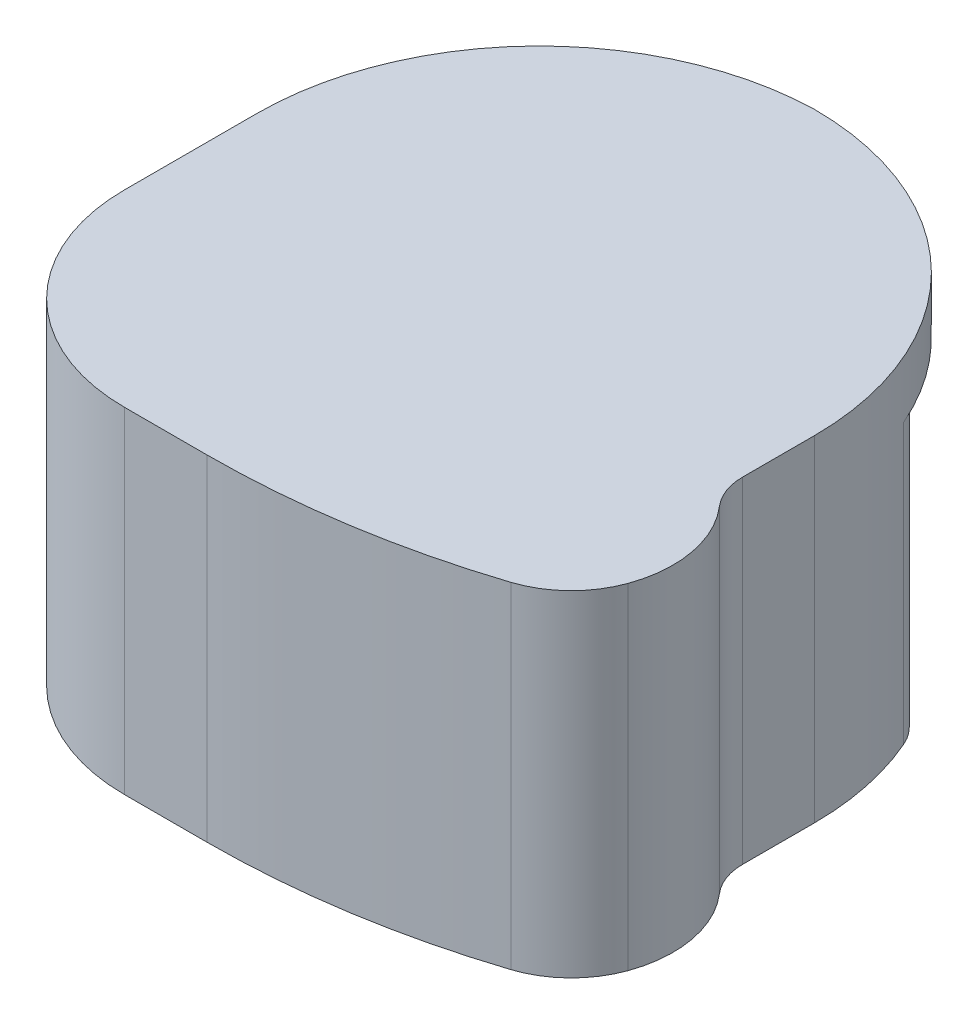
ISO-10303-21;
HEADER;
FILE_DESCRIPTION(('STEP AP214'),'2;1');
FILE_NAME('part.step','',(''),(''),'','','');
FILE_SCHEMA(('AUTOMOTIVE_DESIGN { 1 0 10303 214 1 1 1 1 }'));
ENDSEC;
DATA;
#1=APPLICATION_CONTEXT('core data for automotive mechanical design processes');
#2=APPLICATION_PROTOCOL_DEFINITION('international standard','automotive_design',2000,#1);
#3=PRODUCT_CONTEXT('',#1,'mechanical');
#4=PRODUCT('Part','Part','',(#3));
#5=PRODUCT_RELATED_PRODUCT_CATEGORY('part','',(#4));
#6=PRODUCT_DEFINITION_FORMATION('','',#4);
#7=PRODUCT_DEFINITION_CONTEXT('part definition',#1,'design');
#8=PRODUCT_DEFINITION('design','',#6,#7);
#9=PRODUCT_DEFINITION_SHAPE('','',#8);
#10=(LENGTH_UNIT() NAMED_UNIT(*) SI_UNIT(.MILLI.,.METRE.));
#11=(NAMED_UNIT(*) PLANE_ANGLE_UNIT() SI_UNIT($,.RADIAN.));
#12=(NAMED_UNIT(*) SI_UNIT($,.STERADIAN.) SOLID_ANGLE_UNIT());
#13=UNCERTAINTY_MEASURE_WITH_UNIT(LENGTH_MEASURE(1.E-05),#10,'distance_accuracy_value','');
#14=(GEOMETRIC_REPRESENTATION_CONTEXT(3) GLOBAL_UNCERTAINTY_ASSIGNED_CONTEXT((#13)) GLOBAL_UNIT_ASSIGNED_CONTEXT((#10,
#11,#12)) REPRESENTATION_CONTEXT('',''));
#15=CARTESIAN_POINT('',(0.,0.,0.));
#16=DIRECTION('',(0.,0.,1.));
#17=DIRECTION('',(1.,0.,0.));
#18=AXIS2_PLACEMENT_3D('',#15,#16,#17);
#19=CARTESIAN_POINT('',(26.1999999999403,3.,113.8));
#20=DIRECTION('',(0.,-1.,0.));
#21=DIRECTION('',(0.,0.,-1.));
#22=AXIS2_PLACEMENT_3D('',#19,#20,#21);
#23=CYLINDRICAL_SURFACE('',#22,1.5);
#24=CARTESIAN_POINT('',(26.1999999999403,-14.8,113.8));
#25=DIRECTION('',(0.,1.,0.));
#26=DIRECTION('',(0.,0.,-1.));
#27=AXIS2_PLACEMENT_3D('',#24,#25,#26);
#28=CIRCLE('',#27,1.5);
#29=CARTESIAN_POINT('',(26.1999999999403,-14.8,112.3));
#30=VERTEX_POINT('',#29);
#31=EDGE_CURVE('E213',#30,#30,#28,.T.);
#32=ORIENTED_EDGE('',*,*,#31,.F.);
#33=EDGE_LOOP('',(#32));
#34=FACE_BOUND('',#33,.T.);
#35=CARTESIAN_POINT('',(26.1999999999403,2.8,113.8));
#36=DIRECTION('',(0.,1.,0.));
#37=DIRECTION('',(0.,0.,1.));
#38=AXIS2_PLACEMENT_3D('',#35,#36,#37);
#39=CIRCLE('',#38,1.5);
#40=CARTESIAN_POINT('',(26.1999999999403,2.8,115.3));
#41=VERTEX_POINT('',#40);
#42=EDGE_CURVE('E1001',#41,#41,#39,.T.);
#43=ORIENTED_EDGE('',*,*,#42,.T.);
#44=EDGE_LOOP('',(#43));
#45=FACE_BOUND('',#44,.T.);
#46=ADVANCED_FACE('F35',(#34,#45),#23,.F.);
#47=CARTESIAN_POINT('',(22.2999999999403,3.,97.8000000000001));
#48=DIRECTION('',(0.,-1.,0.));
#49=DIRECTION('',(0.,0.,-1.));
#50=AXIS2_PLACEMENT_3D('',#47,#48,#49);
#51=CYLINDRICAL_SURFACE('',#50,1.5);
#52=CARTESIAN_POINT('',(22.2999999999403,-14.8,97.8000000000001));
#53=DIRECTION('',(0.,1.,0.));
#54=DIRECTION('',(0.,0.,-1.));
#55=AXIS2_PLACEMENT_3D('',#52,#53,#54);
#56=CIRCLE('',#55,1.5);
#57=CARTESIAN_POINT('',(22.2999999999403,-14.8,96.3000000000001));
#58=VERTEX_POINT('',#57);
#59=EDGE_CURVE('E210',#58,#58,#56,.T.);
#60=ORIENTED_EDGE('',*,*,#59,.F.);
#61=EDGE_LOOP('',(#60));
#62=FACE_BOUND('',#61,.T.);
#63=CARTESIAN_POINT('',(22.2999999999403,2.8,97.8000000000001));
#64=DIRECTION('',(0.,1.,0.));
#65=DIRECTION('',(0.,0.,1.));
#66=AXIS2_PLACEMENT_3D('',#63,#64,#65);
#67=CIRCLE('',#66,1.5);
#68=CARTESIAN_POINT('',(22.2999999999403,2.8,99.3000000000001));
#69=VERTEX_POINT('',#68);
#70=EDGE_CURVE('E996',#69,#69,#67,.T.);
#71=ORIENTED_EDGE('',*,*,#70,.T.);
#72=EDGE_LOOP('',(#71));
#73=FACE_BOUND('',#72,.T.);
#74=ADVANCED_FACE('F493',(#62,#73),#51,.F.);
#75=CARTESIAN_POINT('',(37.5999999998806,3.,113.8));
#76=DIRECTION('',(0.,-1.,0.));
#77=DIRECTION('',(0.,0.,-1.));
#78=AXIS2_PLACEMENT_3D('',#75,#76,#77);
#79=CYLINDRICAL_SURFACE('',#78,1.5);
#80=CARTESIAN_POINT('',(37.5999999998806,-14.8,113.8));
#81=DIRECTION('',(0.,1.,0.));
#82=DIRECTION('',(0.,0.,-1.));
#83=AXIS2_PLACEMENT_3D('',#80,#81,#82);
#84=CIRCLE('',#83,1.5);
#85=CARTESIAN_POINT('',(37.5999999998806,-14.8,112.3));
#86=VERTEX_POINT('',#85);
#87=EDGE_CURVE('E977',#86,#86,#84,.T.);
#88=ORIENTED_EDGE('',*,*,#87,.F.);
#89=EDGE_LOOP('',(#88));
#90=FACE_BOUND('',#89,.T.);
#91=CARTESIAN_POINT('',(37.5999999998806,2.8,113.8));
#92=DIRECTION('',(0.,1.,0.));
#93=DIRECTION('',(0.,0.,1.));
#94=AXIS2_PLACEMENT_3D('',#91,#92,#93);
#95=CIRCLE('',#94,1.5);
#96=CARTESIAN_POINT('',(37.5999999998806,2.8,115.3));
#97=VERTEX_POINT('',#96);
#98=EDGE_CURVE('E994',#97,#97,#95,.T.);
#99=ORIENTED_EDGE('',*,*,#98,.T.);
#100=EDGE_LOOP('',(#99));
#101=FACE_BOUND('',#100,.T.);
#102=ADVANCED_FACE('F473',(#90,#101),#79,.F.);
#103=CARTESIAN_POINT('',(44.5999999998807,3.,110.));
#104=DIRECTION('',(0.,-1.,0.));
#105=DIRECTION('',(0.,0.,-1.));
#106=AXIS2_PLACEMENT_3D('',#103,#104,#105);
#107=CYLINDRICAL_SURFACE('',#106,1.8);
#108=CARTESIAN_POINT('',(44.5999999998807,-9.5,110.));
#109=DIRECTION('',(0.,1.,0.));
#110=DIRECTION('',(0.,0.,-1.));
#111=AXIS2_PLACEMENT_3D('',#108,#109,#110);
#112=CIRCLE('',#111,1.8);
#113=CARTESIAN_POINT('',(44.5999999998807,-9.5,108.2));
#114=VERTEX_POINT('',#113);
#115=EDGE_CURVE('E263',#114,#114,#112,.F.);
#116=ORIENTED_EDGE('',*,*,#115,.T.);
#117=EDGE_LOOP('',(#116));
#118=FACE_BOUND('',#117,.T.);
#119=CARTESIAN_POINT('',(44.5999999998807,2.8,110.));
#120=DIRECTION('',(0.,1.,0.));
#121=DIRECTION('',(0.,0.,1.));
#122=AXIS2_PLACEMENT_3D('',#119,#120,#121);
#123=CIRCLE('',#122,1.8);
#124=CARTESIAN_POINT('',(44.5999999998807,2.8,111.8));
#125=VERTEX_POINT('',#124);
#126=EDGE_CURVE('E377',#125,#125,#123,.F.);
#127=ORIENTED_EDGE('',*,*,#126,.F.);
#128=EDGE_LOOP('',(#127));
#129=FACE_BOUND('',#128,.T.);
#130=ADVANCED_FACE('F469',(#118,#129),#107,.F.);
#131=CARTESIAN_POINT('',(44.8999999999403,3.,101.3));
#132=DIRECTION('',(0.,-1.,0.));
#133=DIRECTION('',(0.,0.,-1.));
#134=AXIS2_PLACEMENT_3D('',#131,#132,#133);
#135=CYLINDRICAL_SURFACE('',#134,1.5);
#136=CARTESIAN_POINT('',(44.8999999999403,-14.8,101.3));
#137=DIRECTION('',(0.,1.,0.));
#138=DIRECTION('',(0.,0.,-1.));
#139=AXIS2_PLACEMENT_3D('',#136,#137,#138);
#140=CIRCLE('',#139,1.5);
#141=CARTESIAN_POINT('',(44.8999999999403,-14.8,99.8));
#142=VERTEX_POINT('',#141);
#143=EDGE_CURVE('E981',#142,#142,#140,.T.);
#144=ORIENTED_EDGE('',*,*,#143,.F.);
#145=EDGE_LOOP('',(#144));
#146=FACE_BOUND('',#145,.T.);
#147=CARTESIAN_POINT('',(44.8999999999403,2.8,101.3));
#148=DIRECTION('',(0.,1.,0.));
#149=DIRECTION('',(0.,0.,1.));
#150=AXIS2_PLACEMENT_3D('',#147,#148,#149);
#151=CIRCLE('',#150,1.5);
#152=CARTESIAN_POINT('',(44.8999999999403,2.8,102.8));
#153=VERTEX_POINT('',#152);
#154=EDGE_CURVE('E995',#153,#153,#151,.T.);
#155=ORIENTED_EDGE('',*,*,#154,.T.);
#156=EDGE_LOOP('',(#155));
#157=FACE_BOUND('',#156,.T.);
#158=ADVANCED_FACE('F472',(#146,#157),#135,.F.);
#159=CARTESIAN_POINT('',(33.5999999999403,3.,105.3));
#160=DIRECTION('',(0.,-1.,0.));
#161=DIRECTION('',(0.,0.,-1.));
#162=AXIS2_PLACEMENT_3D('',#159,#160,#161);
#163=CYLINDRICAL_SURFACE('',#162,1.8);
#164=CARTESIAN_POINT('',(33.5999999999403,0.,105.3));
#165=DIRECTION('',(0.,-1.,0.));
#166=DIRECTION('',(0.,0.,1.));
#167=AXIS2_PLACEMENT_3D('',#164,#165,#166);
#168=CIRCLE('',#167,1.8);
#169=CARTESIAN_POINT('',(33.5999999999403,0.,107.1));
#170=VERTEX_POINT('',#169);
#171=EDGE_CURVE('E275',#170,#170,#168,.T.);
#172=ORIENTED_EDGE('',*,*,#171,.T.);
#173=EDGE_LOOP('',(#172));
#174=FACE_BOUND('',#173,.T.);
#175=CARTESIAN_POINT('',(33.5999999999403,1.2,105.3));
#176=DIRECTION('',(0.,1.,0.));
#177=DIRECTION('',(0.,0.,1.));
#178=AXIS2_PLACEMENT_3D('',#175,#176,#177);
#179=CIRCLE('',#178,1.79999999999999);
#180=CARTESIAN_POINT('',(33.5999999999403,1.2,107.1));
#181=VERTEX_POINT('',#180);
#182=EDGE_CURVE('E984',#181,#181,#179,.T.);
#183=ORIENTED_EDGE('',*,*,#182,.T.);
#184=EDGE_LOOP('',(#183));
#185=FACE_BOUND('',#184,.T.);
#186=ADVANCED_FACE('F506',(#174,#185),#163,.F.);
#187=CARTESIAN_POINT('',(33.5999999999403,3.,90.3));
#188=DIRECTION('',(0.,-1.,0.));
#189=DIRECTION('',(0.,0.,-1.));
#190=AXIS2_PLACEMENT_3D('',#187,#188,#189);
#191=CYLINDRICAL_SURFACE('',#190,1.8);
#192=CARTESIAN_POINT('',(33.5999999999403,0.,90.3));
#193=DIRECTION('',(0.,-1.,0.));
#194=DIRECTION('',(0.,0.,1.));
#195=AXIS2_PLACEMENT_3D('',#192,#193,#194);
#196=CIRCLE('',#195,1.8);
#197=CARTESIAN_POINT('',(33.5999999999403,0.,92.1));
#198=VERTEX_POINT('',#197);
#199=EDGE_CURVE('E279',#198,#198,#196,.F.);
#200=ORIENTED_EDGE('',*,*,#199,.F.);
#201=EDGE_LOOP('',(#200));
#202=FACE_BOUND('',#201,.T.);
#203=CARTESIAN_POINT('',(33.5999999999403,1.2,90.3));
#204=DIRECTION('',(0.,1.,0.));
#205=DIRECTION('',(0.,0.,1.));
#206=AXIS2_PLACEMENT_3D('',#203,#204,#205);
#207=CIRCLE('',#206,1.8);
#208=CARTESIAN_POINT('',(33.5999999999403,1.2,92.1));
#209=VERTEX_POINT('',#208);
#210=EDGE_CURVE('E374',#209,#209,#207,.F.);
#211=ORIENTED_EDGE('',*,*,#210,.F.);
#212=EDGE_LOOP('',(#211));
#213=FACE_BOUND('',#212,.T.);
#214=ADVANCED_FACE('F509',(#202,#213),#191,.F.);
#215=CARTESIAN_POINT('',(41.1999999999403,-10.5,110.1));
#216=DIRECTION('',(0.,1.,0.));
#217=DIRECTION('',(0.,0.,1.));
#218=AXIS2_PLACEMENT_3D('',#215,#216,#217);
#219=CYLINDRICAL_SURFACE('',#218,0.2);
#220=CARTESIAN_POINT('',(41.1999999999403,-9.5,110.1));
#221=DIRECTION('',(0.,1.,0.));
#222=DIRECTION('',(0.,0.,-1.));
#223=AXIS2_PLACEMENT_3D('',#220,#221,#222);
#224=CIRCLE('',#223,0.2);
#225=CARTESIAN_POINT('',(41.3999999999403,-9.5,110.1));
#226=VERTEX_POINT('',#225);
#227=CARTESIAN_POINT('',(41.1999999999403,-9.5,110.3));
#228=VERTEX_POINT('',#227);
#229=EDGE_CURVE('E337',#226,#228,#224,.F.);
#230=ORIENTED_EDGE('',*,*,#229,.T.);
#231=DIRECTION('',(0.,1.,0.));
#232=VECTOR('',#231,1.);
#233=CARTESIAN_POINT('',(41.1999999999403,-10.5,110.3));
#234=LINE('',#233,#232);
#235=CARTESIAN_POINT('',(41.1999999999403,0.,110.3));
#236=VERTEX_POINT('',#235);
#237=EDGE_CURVE('E328',#228,#236,#234,.T.);
#238=ORIENTED_EDGE('',*,*,#237,.T.);
#239=CARTESIAN_POINT('',(41.1999999999403,0.,110.1));
#240=DIRECTION('',(0.,-1.,0.));
#241=DIRECTION('',(0.,0.,1.));
#242=AXIS2_PLACEMENT_3D('',#239,#240,#241);
#243=CIRCLE('',#242,0.2);
#244=CARTESIAN_POINT('',(41.3999999999403,0.,110.1));
#245=VERTEX_POINT('',#244);
#246=EDGE_CURVE('E322',#236,#245,#243,.F.);
#247=ORIENTED_EDGE('',*,*,#246,.T.);
#248=DIRECTION('',(0.,1.,0.));
#249=VECTOR('',#248,1.);
#250=CARTESIAN_POINT('',(41.3999999999403,-10.5,110.1));
#251=LINE('',#250,#249);
#252=EDGE_CURVE('E334',#245,#226,#251,.F.);
#253=ORIENTED_EDGE('',*,*,#252,.T.);
#254=EDGE_LOOP('',(#230,#238,#247,#253));
#255=FACE_BOUND('',#254,.T.);
#256=ADVANCED_FACE('F461',(#255),#219,.F.);
#257=CARTESIAN_POINT('',(48.3999999999403,3.,0.));
#258=DIRECTION('',(1.,0.,0.));
#259=DIRECTION('',(0.,0.,1.));
#260=AXIS2_PLACEMENT_3D('',#257,#258,#259);
#261=PLANE('',#260);
#262=DIRECTION('',(0.,0.,-1.));
#263=VECTOR('',#262,1.);
#264=CARTESIAN_POINT('',(48.3999999999403,3.,0.));
#265=LINE('',#264,#263);
#266=CARTESIAN_POINT('',(48.3999999999403,3.,104.104238810875));
#267=VERTEX_POINT('',#266);
#268=CARTESIAN_POINT('',(48.3999999999403,3.,100.3));
#269=VERTEX_POINT('',#268);
#270=EDGE_CURVE('E276',#267,#269,#265,.T.);
#271=ORIENTED_EDGE('',*,*,#270,.F.);
#272=DIRECTION('',(0.,-1.,0.));
#273=VECTOR('',#272,1.);
#274=CARTESIAN_POINT('',(48.3999999999403,3.,104.104238810875));
#275=LINE('',#274,#273);
#276=CARTESIAN_POINT('',(48.3999999999403,-14.8,104.104238810875));
#277=VERTEX_POINT('',#276);
#278=EDGE_CURVE('E386',#267,#277,#275,.T.);
#279=ORIENTED_EDGE('',*,*,#278,.T.);
#280=DIRECTION('',(0.,0.,-1.));
#281=VECTOR('',#280,1.);
#282=CARTESIAN_POINT('',(48.3999999999403,-14.8,105.356725293551));
#283=LINE('',#282,#281);
#284=CARTESIAN_POINT('',(48.3999999999403,-14.8,100.3));
#285=VERTEX_POINT('',#284);
#286=EDGE_CURVE('E252',#277,#285,#283,.T.);
#287=ORIENTED_EDGE('',*,*,#286,.T.);
#288=DIRECTION('',(0.,-1.,0.));
#289=VECTOR('',#288,1.);
#290=CARTESIAN_POINT('',(48.3999999999403,3.,100.3));
#291=LINE('',#290,#289);
#292=EDGE_CURVE('E209',#269,#285,#291,.T.);
#293=ORIENTED_EDGE('',*,*,#292,.F.);
#294=EDGE_LOOP('',(#271,#279,#287,#293));
#295=FACE_BOUND('',#294,.T.);
#296=ADVANCED_FACE('F392',(#295),#261,.T.);
#297=CARTESIAN_POINT('',(44.5999999998807,3.,110.));
#298=DIRECTION('',(0.,-1.,0.));
#299=DIRECTION('',(0.,0.,-1.));
#300=AXIS2_PLACEMENT_3D('',#297,#298,#299);
#301=CYLINDRICAL_SURFACE('',#300,6.);
#302=CARTESIAN_POINT('',(44.5999999998807,-14.8,110.));
#303=DIRECTION('',(0.,1.,0.));
#304=DIRECTION('',(0.,0.,-1.));
#305=AXIS2_PLACEMENT_3D('',#302,#303,#304);
#306=CIRCLE('',#305,6.);
#307=CARTESIAN_POINT('',(50.2472360342484,-14.8,112.026999055781));
#308=VERTEX_POINT('',#307);
#309=CARTESIAN_POINT('',(49.1333333332538,-14.8,106.069492540583));
#310=VERTEX_POINT('',#309);
#311=EDGE_CURVE('E250',#308,#310,#306,.T.);
#312=ORIENTED_EDGE('',*,*,#311,.T.);
#313=DIRECTION('',(0.,-1.,0.));
#314=VECTOR('',#313,1.);
#315=CARTESIAN_POINT('',(49.1333333332538,3.,106.069492540583));
#316=LINE('',#315,#314);
#317=CARTESIAN_POINT('',(49.1333333332538,3.,106.069492540583));
#318=VERTEX_POINT('',#317);
#319=EDGE_CURVE('E57',#310,#318,#316,.F.);
#320=ORIENTED_EDGE('',*,*,#319,.T.);
#321=CARTESIAN_POINT('',(44.5999999998807,3.,110.));
#322=DIRECTION('',(0.,-1.,0.));
#323=DIRECTION('',(0.,0.,1.));
#324=AXIS2_PLACEMENT_3D('',#321,#322,#323);
#325=CIRCLE('',#324,6.);
#326=CARTESIAN_POINT('',(50.2472360342484,3.,112.026999055781));
#327=VERTEX_POINT('',#326);
#328=EDGE_CURVE('E278',#318,#327,#325,.T.);
#329=ORIENTED_EDGE('',*,*,#328,.T.);
#330=DIRECTION('',(0.,-1.,0.));
#331=VECTOR('',#330,1.);
#332=CARTESIAN_POINT('',(50.2472360342484,3.,112.026999055781));
#333=LINE('',#332,#331);
#334=EDGE_CURVE('E307',#308,#327,#333,.F.);
#335=ORIENTED_EDGE('',*,*,#334,.F.);
#336=EDGE_LOOP('',(#312,#320,#329,#335));
#337=FACE_BOUND('',#336,.T.);
#338=ADVANCED_FACE('F401',(#337),#301,.T.);
#339=CARTESIAN_POINT('',(37.5999999998806,3.,117.3));
#340=DIRECTION('',(0.,0.,-1.));
#341=DIRECTION('',(1.,0.,0.));
#342=AXIS2_PLACEMENT_3D('',#339,#340,#341);
#343=PLANE('',#342);
#344=DIRECTION('',(-1.,0.,0.));
#345=VECTOR('',#344,1.);
#346=CARTESIAN_POINT('',(37.5999999998806,3.,117.3));
#347=LINE('',#346,#345);
#348=CARTESIAN_POINT('',(33.1669081557272,3.,117.3));
#349=VERTEX_POINT('',#348);
#350=CARTESIAN_POINT('',(28.7999999999403,3.,117.3));
#351=VERTEX_POINT('',#350);
#352=EDGE_CURVE('E281',#349,#351,#347,.T.);
#353=ORIENTED_EDGE('',*,*,#352,.T.);
#354=DIRECTION('',(0.,-1.,0.));
#355=VECTOR('',#354,1.);
#356=CARTESIAN_POINT('',(28.7999999999403,3.,117.3));
#357=LINE('',#356,#355);
#358=CARTESIAN_POINT('',(28.7999999999403,-14.8,117.3));
#359=VERTEX_POINT('',#358);
#360=EDGE_CURVE('E294',#359,#351,#357,.F.);
#361=ORIENTED_EDGE('',*,*,#360,.F.);
#362=DIRECTION('',(1.,0.,0.));
#363=VECTOR('',#362,1.);
#364=CARTESIAN_POINT('',(28.7999999999403,-14.8,117.3));
#365=LINE('',#364,#363);
#366=CARTESIAN_POINT('',(33.1669081557272,-14.8,117.3));
#367=VERTEX_POINT('',#366);
#368=EDGE_CURVE('E242',#359,#367,#365,.T.);
#369=ORIENTED_EDGE('',*,*,#368,.T.);
#370=DIRECTION('',(0.,-1.,0.));
#371=VECTOR('',#370,1.);
#372=CARTESIAN_POINT('',(33.1669081557272,3.,117.3));
#373=LINE('',#372,#371);
#374=EDGE_CURVE('E299',#349,#367,#373,.T.);
#375=ORIENTED_EDGE('',*,*,#374,.F.);
#376=EDGE_LOOP('',(#353,#361,#369,#375));
#377=FACE_BOUND('',#376,.T.);
#378=ADVANCED_FACE('F411',(#377),#343,.F.);
#379=CARTESIAN_POINT('',(18.7999999999403,3.,0.));
#380=DIRECTION('',(-1.,0.,0.));
#381=DIRECTION('',(0.,0.,-1.));
#382=AXIS2_PLACEMENT_3D('',#379,#380,#381);
#383=PLANE('',#382);
#384=DIRECTION('',(0.,-1.,0.));
#385=VECTOR('',#384,1.);
#386=CARTESIAN_POINT('',(18.7999999999403,-10.5,107.3));
#387=LINE('',#386,#385);
#388=CARTESIAN_POINT('',(18.7999999999403,3.,107.3));
#389=VERTEX_POINT('',#388);
#390=CARTESIAN_POINT('',(18.7999999999403,-14.8,107.3));
#391=VERTEX_POINT('',#390);
#392=EDGE_CURVE('E287',#389,#391,#387,.T.);
#393=ORIENTED_EDGE('',*,*,#392,.F.);
#394=DIRECTION('',(0.,0.,1.));
#395=VECTOR('',#394,1.);
#396=CARTESIAN_POINT('',(18.7999999999403,3.,0.));
#397=LINE('',#396,#395);
#398=CARTESIAN_POINT('',(18.7999999999403,3.,100.294665718181));
#399=VERTEX_POINT('',#398);
#400=EDGE_CURVE('E284',#399,#389,#397,.T.);
#401=ORIENTED_EDGE('',*,*,#400,.F.);
#402=DIRECTION('',(0.,1.,0.));
#403=VECTOR('',#402,1.);
#404=CARTESIAN_POINT('',(18.7999999999403,3.,100.294665718181));
#405=LINE('',#404,#403);
#406=CARTESIAN_POINT('',(18.7999999999403,-14.8,100.294665718181));
#407=VERTEX_POINT('',#406);
#408=EDGE_CURVE('E359',#407,#399,#405,.T.);
#409=ORIENTED_EDGE('',*,*,#408,.F.);
#410=DIRECTION('',(0.,0.,1.));
#411=VECTOR('',#410,1.);
#412=CARTESIAN_POINT('',(18.7999999999403,-14.8,100.294665718181));
#413=LINE('',#412,#411);
#414=EDGE_CURVE('E237',#407,#391,#413,.T.);
#415=ORIENTED_EDGE('',*,*,#414,.T.);
#416=EDGE_LOOP('',(#393,#401,#409,#415));
#417=FACE_BOUND('',#416,.T.);
#418=ADVANCED_FACE('F419',(#417),#383,.T.);
#419=CARTESIAN_POINT('',(37.5999999998806,3.,0.));
#420=DIRECTION('',(0.,1.,0.));
#421=DIRECTION('',(0.,0.,1.));
#422=AXIS2_PLACEMENT_3D('',#419,#420,#421);
#423=PLANE('',#422);
#424=ORIENTED_EDGE('',*,*,#400,.T.);
#425=CARTESIAN_POINT('',(28.7999999999403,3.,107.3));
#426=DIRECTION('',(0.,-1.,0.));
#427=DIRECTION('',(0.,0.,1.));
#428=AXIS2_PLACEMENT_3D('',#425,#426,#427);
#429=CIRCLE('',#428,10.);
#430=EDGE_CURVE('E297',#351,#389,#429,.T.);
#431=ORIENTED_EDGE('',*,*,#430,.F.);
#432=ORIENTED_EDGE('',*,*,#352,.F.);
#433=CARTESIAN_POINT('',(33.1669081557272,3.,72.3));
#434=DIRECTION('',(0.,-1.,0.));
#435=DIRECTION('',(0.,0.,1.));
#436=AXIS2_PLACEMENT_3D('',#433,#434,#435);
#437=CIRCLE('',#436,45.);
#438=CARTESIAN_POINT('',(47.0879932368438,3.,115.092562322959));
#439=VERTEX_POINT('',#438);
#440=EDGE_CURVE('E302',#439,#349,#437,.T.);
#441=ORIENTED_EDGE('',*,*,#440,.F.);
#442=CARTESIAN_POINT('',(45.5412060056086,3.,110.337833175963));
#443=DIRECTION('',(0.,-1.,0.));
#444=DIRECTION('',(0.,0.,1.));
#445=AXIS2_PLACEMENT_3D('',#442,#443,#444);
#446=CIRCLE('',#445,5.);
#447=EDGE_CURVE('E310',#327,#439,#446,.T.);
#448=ORIENTED_EDGE('',*,*,#447,.F.);
#449=ORIENTED_EDGE('',*,*,#328,.F.);
#450=CARTESIAN_POINT('',(51.3999999999403,3.,104.104238810875));
#451=DIRECTION('',(0.,1.,0.));
#452=DIRECTION('',(0.,0.,1.));
#453=AXIS2_PLACEMENT_3D('',#450,#451,#452);
#454=CIRCLE('',#453,3.);
#455=EDGE_CURVE('E11',#318,#267,#454,.F.);
#456=ORIENTED_EDGE('',*,*,#455,.T.);
#457=ORIENTED_EDGE('',*,*,#270,.T.);
#458=CARTESIAN_POINT('',(33.3999999999403,3.,100.3));
#459=DIRECTION('',(0.,-1.,0.));
#460=DIRECTION('',(0.,0.,1.));
#461=AXIS2_PLACEMENT_3D('',#458,#459,#460);
#462=CIRCLE('',#461,15.);
#463=CARTESIAN_POINT('',(33.3999999999403,3.,85.3));
#464=VERTEX_POINT('',#463);
#465=EDGE_CURVE('E318',#464,#269,#462,.T.);
#466=ORIENTED_EDGE('',*,*,#465,.F.);
#467=CARTESIAN_POINT('',(33.7999999999403,3.,100.294665718181));
#468=DIRECTION('',(0.,-1.,0.));
#469=DIRECTION('',(0.,0.,1.));
#470=AXIS2_PLACEMENT_3D('',#467,#468,#469);
#471=CIRCLE('',#470,15.);
#472=EDGE_CURVE('E362',#399,#464,#471,.T.);
#473=ORIENTED_EDGE('',*,*,#472,.F.);
#474=EDGE_LOOP('',(#424,#431,#432,#441,#448,#449,#456,#457,#466,#473));
#475=FACE_BOUND('',#474,.T.);
#476=ADVANCED_FACE('F396',(#475),#423,.T.);
#477=CARTESIAN_POINT('',(37.5999999998806,0.,0.));
#478=DIRECTION('',(0.,1.,0.));
#479=DIRECTION('',(0.,0.,1.));
#480=AXIS2_PLACEMENT_3D('',#477,#478,#479);
#481=PLANE('',#480);
#482=CARTESIAN_POINT('',(33.3999999999403,0.,100.3));
#483=DIRECTION('',(0.,-1.,0.));
#484=DIRECTION('',(0.,0.,1.));
#485=AXIS2_PLACEMENT_3D('',#482,#483,#484);
#486=CIRCLE('',#485,15.);
#487=CARTESIAN_POINT('',(47.1499999999403,0.,94.3052105958591));
#488=VERTEX_POINT('',#487);
#489=CARTESIAN_POINT('',(33.3999999999403,0.,85.3));
#490=VERTEX_POINT('',#489);
#491=EDGE_CURVE('E314',#488,#490,#486,.F.);
#492=ORIENTED_EDGE('',*,*,#491,.F.);
#493=CARTESIAN_POINT('',(44.3999999999403,0.,95.5041684766873));
#494=DIRECTION('',(0.,-1.,0.));
#495=DIRECTION('',(0.,0.,1.));
#496=AXIS2_PLACEMENT_3D('',#493,#494,#495);
#497=CIRCLE('',#496,3.);
#498=CARTESIAN_POINT('',(41.3999999999403,0.,95.5041684766873));
#499=VERTEX_POINT('',#498);
#500=EDGE_CURVE('E199',#499,#488,#497,.T.);
#501=ORIENTED_EDGE('',*,*,#500,.F.);
#502=DIRECTION('',(0.,0.,-1.));
#503=VECTOR('',#502,1.);
#504=CARTESIAN_POINT('',(41.3999999999403,0.,0.));
#505=LINE('',#504,#503);
#506=EDGE_CURVE('E272',#245,#499,#505,.T.);
#507=ORIENTED_EDGE('',*,*,#506,.F.);
#508=ORIENTED_EDGE('',*,*,#246,.F.);
#509=DIRECTION('',(-1.,0.,0.));
#510=VECTOR('',#509,1.);
#511=CARTESIAN_POINT('',(37.5999999998806,0.,110.3));
#512=LINE('',#511,#510);
#513=CARTESIAN_POINT('',(25.9999999999403,0.,110.3));
#514=VERTEX_POINT('',#513);
#515=EDGE_CURVE('E269',#236,#514,#512,.T.);
#516=ORIENTED_EDGE('',*,*,#515,.T.);
#517=CARTESIAN_POINT('',(25.9999999999403,0.,110.1));
#518=DIRECTION('',(0.,-1.,0.));
#519=DIRECTION('',(0.,0.,1.));
#520=AXIS2_PLACEMENT_3D('',#517,#518,#519);
#521=CIRCLE('',#520,0.2);
#522=CARTESIAN_POINT('',(25.7999999999403,0.,110.1));
#523=VERTEX_POINT('',#522);
#524=EDGE_CURVE('E325',#523,#514,#521,.F.);
#525=ORIENTED_EDGE('',*,*,#524,.F.);
#526=DIRECTION('',(0.,0.,1.));
#527=VECTOR('',#526,1.);
#528=CARTESIAN_POINT('',(25.7999999999403,0.,0.));
#529=LINE('',#528,#527);
#530=CARTESIAN_POINT('',(25.7999999999403,0.,95.4988341948686));
#531=VERTEX_POINT('',#530);
#532=EDGE_CURVE('E266',#531,#523,#529,.T.);
#533=ORIENTED_EDGE('',*,*,#532,.F.);
#534=CARTESIAN_POINT('',(22.7999999999403,0.,95.4988341948686));
#535=DIRECTION('',(0.,-1.,0.));
#536=DIRECTION('',(0.,0.,1.));
#537=AXIS2_PLACEMENT_3D('',#534,#535,#536);
#538=CIRCLE('',#537,3.);
#539=CARTESIAN_POINT('',(20.0499999999403,0.,94.2998763140404));
#540=VERTEX_POINT('',#539);
#541=EDGE_CURVE('E371',#540,#531,#538,.T.);
#542=ORIENTED_EDGE('',*,*,#541,.F.);
#543=CARTESIAN_POINT('',(33.7999999999403,0.,100.294665718181));
#544=DIRECTION('',(0.,-1.,0.));
#545=DIRECTION('',(0.,0.,1.));
#546=AXIS2_PLACEMENT_3D('',#543,#544,#545);
#547=CIRCLE('',#546,15.);
#548=EDGE_CURVE('E356',#490,#540,#547,.F.);
#549=ORIENTED_EDGE('',*,*,#548,.F.);
#550=EDGE_LOOP('',(#492,#501,#507,#508,#516,#525,#533,#542,#549));
#551=FACE_BOUND('',#550,.T.);
#552=ORIENTED_EDGE('',*,*,#171,.F.);
#553=EDGE_LOOP('',(#552));
#554=FACE_BOUND('',#553,.T.);
#555=ORIENTED_EDGE('',*,*,#199,.T.);
#556=EDGE_LOOP('',(#555));
#557=FACE_BOUND('',#556,.T.);
#558=ADVANCED_FACE('F456',(#551,#554,#557),#481,.F.);
#559=CARTESIAN_POINT('',(41.3999999999403,-10.5,0.));
#560=DIRECTION('',(-1.,0.,0.));
#561=DIRECTION('',(0.,0.,-1.));
#562=AXIS2_PLACEMENT_3D('',#559,#560,#561);
#563=PLANE('',#562);
#564=DIRECTION('',(0.,1.,0.));
#565=VECTOR('',#564,1.);
#566=CARTESIAN_POINT('',(41.3999999999403,-10.5,105.233187647886));
#567=LINE('',#566,#565);
#568=CARTESIAN_POINT('',(41.3999999999403,-9.5,105.233187647886));
#569=VERTEX_POINT('',#568);
#570=CARTESIAN_POINT('',(41.3999999999403,-14.8,105.233187647886));
#571=VERTEX_POINT('',#570);
#572=EDGE_CURVE('E348',#569,#571,#567,.F.);
#573=ORIENTED_EDGE('',*,*,#572,.F.);
#574=DIRECTION('',(0.,0.,-1.));
#575=VECTOR('',#574,1.);
#576=CARTESIAN_POINT('',(41.3999999999403,-9.5,0.));
#577=LINE('',#576,#575);
#578=EDGE_CURVE('E260',#226,#569,#577,.T.);
#579=ORIENTED_EDGE('',*,*,#578,.F.);
#580=ORIENTED_EDGE('',*,*,#252,.F.);
#581=ORIENTED_EDGE('',*,*,#506,.T.);
#582=DIRECTION('',(0.,-1.,0.));
#583=VECTOR('',#582,1.);
#584=CARTESIAN_POINT('',(41.3999999999403,-10.5,95.5041684766873));
#585=LINE('',#584,#583);
#586=CARTESIAN_POINT('',(41.3999999999403,-14.8,95.5041684766873));
#587=VERTEX_POINT('',#586);
#588=EDGE_CURVE('E204',#587,#499,#585,.F.);
#589=ORIENTED_EDGE('',*,*,#588,.F.);
#590=DIRECTION('',(0.,0.,1.));
#591=VECTOR('',#590,1.);
#592=CARTESIAN_POINT('',(41.3999999999403,-14.8,95.5041684766873));
#593=LINE('',#592,#591);
#594=EDGE_CURVE('E191',#587,#571,#593,.T.);
#595=ORIENTED_EDGE('',*,*,#594,.T.);
#596=EDGE_LOOP('',(#573,#579,#580,#581,#589,#595));
#597=FACE_BOUND('',#596,.T.);
#598=ADVANCED_FACE('F452',(#597),#563,.T.);
#599=CARTESIAN_POINT('',(37.5999999998806,-10.5,110.3));
#600=DIRECTION('',(0.,0.,1.));
#601=DIRECTION('',(-1.,0.,0.));
#602=AXIS2_PLACEMENT_3D('',#599,#600,#601);
#603=PLANE('',#602);
#604=DIRECTION('',(0.,1.,0.));
#605=VECTOR('',#604,1.);
#606=CARTESIAN_POINT('',(25.9999999999403,-10.5,110.3));
#607=LINE('',#606,#605);
#608=CARTESIAN_POINT('',(25.9999999999403,-14.8,110.3));
#609=VERTEX_POINT('',#608);
#610=EDGE_CURVE('E331',#514,#609,#607,.F.);
#611=ORIENTED_EDGE('',*,*,#610,.F.);
#612=ORIENTED_EDGE('',*,*,#515,.F.);
#613=ORIENTED_EDGE('',*,*,#237,.F.);
#614=DIRECTION('',(-1.,0.,0.));
#615=VECTOR('',#614,1.);
#616=CARTESIAN_POINT('',(37.5999999998806,-9.5,110.3));
#617=LINE('',#616,#615);
#618=CARTESIAN_POINT('',(39.5134982550663,-9.5,110.3));
#619=VERTEX_POINT('',#618);
#620=EDGE_CURVE('E257',#228,#619,#617,.T.);
#621=ORIENTED_EDGE('',*,*,#620,.T.);
#622=DIRECTION('',(0.,-1.,0.));
#623=VECTOR('',#622,1.);
#624=CARTESIAN_POINT('',(39.5134982550663,-10.5,110.3));
#625=LINE('',#624,#623);
#626=CARTESIAN_POINT('',(39.5134982550663,-14.8,110.3));
#627=VERTEX_POINT('',#626);
#628=EDGE_CURVE('E340',#627,#619,#625,.F.);
#629=ORIENTED_EDGE('',*,*,#628,.F.);
#630=DIRECTION('',(-1.,0.,0.));
#631=VECTOR('',#630,1.);
#632=CARTESIAN_POINT('',(39.5134982550663,-14.8,110.3));
#633=LINE('',#632,#631);
#634=EDGE_CURVE('E225',#627,#609,#633,.T.);
#635=ORIENTED_EDGE('',*,*,#634,.T.);
#636=EDGE_LOOP('',(#611,#612,#613,#621,#629,#635));
#637=FACE_BOUND('',#636,.T.);
#638=ADVANCED_FACE('F438',(#637),#603,.F.);
#639=CARTESIAN_POINT('',(25.7999999999403,-10.5,0.));
#640=DIRECTION('',(1.,0.,0.));
#641=DIRECTION('',(0.,0.,1.));
#642=AXIS2_PLACEMENT_3D('',#639,#640,#641);
#643=PLANE('',#642);
#644=ORIENTED_EDGE('',*,*,#532,.T.);
#645=DIRECTION('',(0.,1.,0.));
#646=VECTOR('',#645,1.);
#647=CARTESIAN_POINT('',(25.7999999999403,-10.5,110.1));
#648=LINE('',#647,#646);
#649=CARTESIAN_POINT('',(25.7999999999403,-14.8,110.1));
#650=VERTEX_POINT('',#649);
#651=EDGE_CURVE('E320',#650,#523,#648,.T.);
#652=ORIENTED_EDGE('',*,*,#651,.F.);
#653=DIRECTION('',(0.,0.,-1.));
#654=VECTOR('',#653,1.);
#655=CARTESIAN_POINT('',(25.7999999999403,-14.8,110.1));
#656=LINE('',#655,#654);
#657=CARTESIAN_POINT('',(25.7999999999403,-14.8,95.4988341948686));
#658=VERTEX_POINT('',#657);
#659=EDGE_CURVE('E230',#650,#658,#656,.T.);
#660=ORIENTED_EDGE('',*,*,#659,.T.);
#661=DIRECTION('',(0.,-1.,0.));
#662=VECTOR('',#661,1.);
#663=CARTESIAN_POINT('',(25.7999999999403,-10.5,95.4988341948686));
#664=LINE('',#663,#662);
#665=EDGE_CURVE('E203',#531,#658,#664,.T.);
#666=ORIENTED_EDGE('',*,*,#665,.F.);
#667=EDGE_LOOP('',(#644,#652,#660,#666));
#668=FACE_BOUND('',#667,.T.);
#669=ADVANCED_FACE('F431',(#668),#643,.T.);
#670=CARTESIAN_POINT('',(28.7999999999403,3.,107.3));
#671=DIRECTION('',(0.,1.,0.));
#672=DIRECTION('',(0.,0.,1.));
#673=AXIS2_PLACEMENT_3D('',#670,#671,#672);
#674=CYLINDRICAL_SURFACE('',#673,10.);
#675=ORIENTED_EDGE('',*,*,#430,.T.);
#676=ORIENTED_EDGE('',*,*,#392,.T.);
#677=CARTESIAN_POINT('',(28.7999999999403,-14.8,107.3));
#678=DIRECTION('',(0.,1.,0.));
#679=DIRECTION('',(0.,0.,-1.));
#680=AXIS2_PLACEMENT_3D('',#677,#678,#679);
#681=CIRCLE('',#680,10.);
#682=EDGE_CURVE('E240',#391,#359,#681,.T.);
#683=ORIENTED_EDGE('',*,*,#682,.T.);
#684=ORIENTED_EDGE('',*,*,#360,.T.);
#685=EDGE_LOOP('',(#675,#676,#683,#684));
#686=FACE_BOUND('',#685,.T.);
#687=ADVANCED_FACE('F413',(#686),#674,.T.);
#688=CARTESIAN_POINT('',(33.1669081557272,3.,72.3));
#689=DIRECTION('',(0.,-1.,0.));
#690=DIRECTION('',(0.,0.,-1.));
#691=AXIS2_PLACEMENT_3D('',#688,#689,#690);
#692=CYLINDRICAL_SURFACE('',#691,45.);
#693=ORIENTED_EDGE('',*,*,#440,.T.);
#694=ORIENTED_EDGE('',*,*,#374,.T.);
#695=CARTESIAN_POINT('',(33.1669081557272,-14.8,72.3));
#696=DIRECTION('',(0.,1.,0.));
#697=DIRECTION('',(0.,0.,-1.));
#698=AXIS2_PLACEMENT_3D('',#695,#696,#697);
#699=CIRCLE('',#698,45.);
#700=CARTESIAN_POINT('',(47.0879932368438,-14.8,115.092562322959));
#701=VERTEX_POINT('',#700);
#702=EDGE_CURVE('E245',#367,#701,#699,.T.);
#703=ORIENTED_EDGE('',*,*,#702,.T.);
#704=DIRECTION('',(0.,-1.,0.));
#705=VECTOR('',#704,1.);
#706=CARTESIAN_POINT('',(47.0879932368438,3.,115.092562322959));
#707=LINE('',#706,#705);
#708=EDGE_CURVE('E304',#439,#701,#707,.T.);
#709=ORIENTED_EDGE('',*,*,#708,.F.);
#710=EDGE_LOOP('',(#693,#694,#703,#709));
#711=FACE_BOUND('',#710,.T.);
#712=ADVANCED_FACE('F408',(#711),#692,.T.);
#713=CARTESIAN_POINT('',(45.5412060056086,3.,110.337833175963));
#714=DIRECTION('',(0.,-1.,0.));
#715=DIRECTION('',(0.,0.,-1.));
#716=AXIS2_PLACEMENT_3D('',#713,#714,#715);
#717=CYLINDRICAL_SURFACE('',#716,5.);
#718=ORIENTED_EDGE('',*,*,#447,.T.);
#719=ORIENTED_EDGE('',*,*,#708,.T.);
#720=CARTESIAN_POINT('',(45.5412060056086,-14.8,110.337833175963));
#721=DIRECTION('',(0.,1.,0.));
#722=DIRECTION('',(0.,0.,-1.));
#723=AXIS2_PLACEMENT_3D('',#720,#721,#722);
#724=CIRCLE('',#723,4.99999999999999);
#725=EDGE_CURVE('E248',#701,#308,#724,.T.);
#726=ORIENTED_EDGE('',*,*,#725,.T.);
#727=ORIENTED_EDGE('',*,*,#334,.T.);
#728=EDGE_LOOP('',(#718,#719,#726,#727));
#729=FACE_BOUND('',#728,.T.);
#730=ADVANCED_FACE('F403',(#729),#717,.T.);
#731=CARTESIAN_POINT('',(33.3999999999403,3.,100.3));
#732=DIRECTION('',(0.,-1.,0.));
#733=DIRECTION('',(0.,0.,-1.));
#734=AXIS2_PLACEMENT_3D('',#731,#732,#733);
#735=CYLINDRICAL_SURFACE('',#734,15.);
#736=ORIENTED_EDGE('',*,*,#491,.T.);
#737=DIRECTION('',(0.,-1.,0.));
#738=VECTOR('',#737,1.);
#739=CARTESIAN_POINT('',(33.3999999999403,3.,85.3));
#740=LINE('',#739,#738);
#741=EDGE_CURVE('E316',#490,#464,#740,.F.);
#742=ORIENTED_EDGE('',*,*,#741,.T.);
#743=ORIENTED_EDGE('',*,*,#465,.T.);
#744=ORIENTED_EDGE('',*,*,#292,.T.);
#745=CARTESIAN_POINT('',(33.3999999999403,-14.8,100.3));
#746=DIRECTION('',(0.,1.,0.));
#747=DIRECTION('',(0.,0.,-1.));
#748=AXIS2_PLACEMENT_3D('',#745,#746,#747);
#749=CIRCLE('',#748,15.);
#750=CARTESIAN_POINT('',(47.1499999999403,-14.8,94.3052105958591));
#751=VERTEX_POINT('',#750);
#752=EDGE_CURVE('E188',#285,#751,#749,.T.);
#753=ORIENTED_EDGE('',*,*,#752,.T.);
#754=DIRECTION('',(0.,-1.,0.));
#755=VECTOR('',#754,1.);
#756=CARTESIAN_POINT('',(47.1499999999403,3.,94.3052105958591));
#757=LINE('',#756,#755);
#758=EDGE_CURVE('E196',#488,#751,#757,.T.);
#759=ORIENTED_EDGE('',*,*,#758,.F.);
#760=EDGE_LOOP('',(#736,#742,#743,#744,#753,#759));
#761=FACE_BOUND('',#760,.T.);
#762=ADVANCED_FACE('F206',(#761),#735,.T.);
#763=CARTESIAN_POINT('',(25.9999999999403,-10.5,110.1));
#764=DIRECTION('',(0.,1.,0.));
#765=DIRECTION('',(0.,0.,1.));
#766=AXIS2_PLACEMENT_3D('',#763,#764,#765);
#767=CYLINDRICAL_SURFACE('',#766,0.2);
#768=ORIENTED_EDGE('',*,*,#651,.T.);
#769=ORIENTED_EDGE('',*,*,#524,.T.);
#770=ORIENTED_EDGE('',*,*,#610,.T.);
#771=CARTESIAN_POINT('',(25.9999999999403,-14.8,110.1));
#772=DIRECTION('',(0.,-1.,0.));
#773=DIRECTION('',(0.,0.,-1.));
#774=AXIS2_PLACEMENT_3D('',#771,#772,#773);
#775=CIRCLE('',#774,0.200000000000004);
#776=EDGE_CURVE('E228',#609,#650,#775,.T.);
#777=ORIENTED_EDGE('',*,*,#776,.T.);
#778=EDGE_LOOP('',(#768,#769,#770,#777));
#779=FACE_BOUND('',#778,.T.);
#780=ADVANCED_FACE('F434',(#779),#767,.F.);
#781=CARTESIAN_POINT('',(44.5999999998807,-9.5,110.));
#782=DIRECTION('',(0.,-1.,0.));
#783=DIRECTION('',(0.,0.,-1.));
#784=AXIS2_PLACEMENT_3D('',#781,#782,#783);
#785=PLANE('',#784);
#786=ORIENTED_EDGE('',*,*,#229,.F.);
#787=ORIENTED_EDGE('',*,*,#578,.T.);
#788=CARTESIAN_POINT('',(42.3999999999403,-9.5,105.233187647886));
#789=DIRECTION('',(0.,1.,0.));
#790=DIRECTION('',(0.,0.,-1.));
#791=AXIS2_PLACEMENT_3D('',#788,#789,#790);
#792=CIRCLE('',#791,1.);
#793=CARTESIAN_POINT('',(42.8190476189766,-9.5,106.141151905432));
#794=VERTEX_POINT('',#793);
#795=EDGE_CURVE('E354',#794,#569,#792,.F.);
#796=ORIENTED_EDGE('',*,*,#795,.F.);
#797=CARTESIAN_POINT('',(44.5999999998807,-9.5,110.));
#798=DIRECTION('',(0.,1.,0.));
#799=DIRECTION('',(0.,0.,-1.));
#800=AXIS2_PLACEMENT_3D('',#797,#798,#799);
#801=CIRCLE('',#800,4.25);
#802=CARTESIAN_POINT('',(40.482355730269,-9.5,111.052380952381));
#803=VERTEX_POINT('',#802);
#804=EDGE_CURVE('E254',#803,#794,#801,.T.);
#805=ORIENTED_EDGE('',*,*,#804,.F.);
#806=CARTESIAN_POINT('',(39.5134982550663,-9.5,111.3));
#807=DIRECTION('',(0.,1.,0.));
#808=DIRECTION('',(0.,0.,-1.));
#809=AXIS2_PLACEMENT_3D('',#806,#807,#808);
#810=CIRCLE('',#809,1.);
#811=EDGE_CURVE('E351',#619,#803,#810,.F.);
#812=ORIENTED_EDGE('',*,*,#811,.F.);
#813=ORIENTED_EDGE('',*,*,#620,.F.);
#814=EDGE_LOOP('',(#786,#787,#796,#805,#812,#813));
#815=FACE_BOUND('',#814,.T.);
#816=ORIENTED_EDGE('',*,*,#115,.F.);
#817=EDGE_LOOP('',(#816));
#818=FACE_BOUND('',#817,.T.);
#819=ADVANCED_FACE('F463',(#815,#818),#785,.T.);
#820=CARTESIAN_POINT('',(44.5999999998807,-9.5,110.));
#821=DIRECTION('',(0.,-1.,0.));
#822=DIRECTION('',(0.,0.,-1.));
#823=AXIS2_PLACEMENT_3D('',#820,#821,#822);
#824=CYLINDRICAL_SURFACE('',#823,4.25);
#825=ORIENTED_EDGE('',*,*,#804,.T.);
#826=DIRECTION('',(0.,-1.,0.));
#827=VECTOR('',#826,1.);
#828=CARTESIAN_POINT('',(42.8190476189766,-9.5,106.141151905432));
#829=LINE('',#828,#827);
#830=CARTESIAN_POINT('',(42.8190476189766,-14.8,106.141151905432));
#831=VERTEX_POINT('',#830);
#832=EDGE_CURVE('E343',#831,#794,#829,.F.);
#833=ORIENTED_EDGE('',*,*,#832,.F.);
#834=CARTESIAN_POINT('',(44.5999999998807,-14.8,110.));
#835=DIRECTION('',(0.,-1.,0.));
#836=DIRECTION('',(0.,0.,-1.));
#837=AXIS2_PLACEMENT_3D('',#834,#835,#836);
#838=CIRCLE('',#837,4.25);
#839=CARTESIAN_POINT('',(40.482355730269,-14.8,111.052380952381));
#840=VERTEX_POINT('',#839);
#841=EDGE_CURVE('E220',#831,#840,#838,.T.);
#842=ORIENTED_EDGE('',*,*,#841,.T.);
#843=DIRECTION('',(0.,-1.,0.));
#844=VECTOR('',#843,1.);
#845=CARTESIAN_POINT('',(40.482355730269,-9.5,111.052380952381));
#846=LINE('',#845,#844);
#847=EDGE_CURVE('E345',#803,#840,#846,.T.);
#848=ORIENTED_EDGE('',*,*,#847,.F.);
#849=EDGE_LOOP('',(#825,#833,#842,#848));
#850=FACE_BOUND('',#849,.T.);
#851=ADVANCED_FACE('F446',(#850),#824,.F.);
#852=CARTESIAN_POINT('',(39.5134982550663,-9.5,111.3));
#853=DIRECTION('',(0.,-1.,0.));
#854=DIRECTION('',(0.,0.,-1.));
#855=AXIS2_PLACEMENT_3D('',#852,#853,#854);
#856=CYLINDRICAL_SURFACE('',#855,1.);
#857=ORIENTED_EDGE('',*,*,#628,.T.);
#858=ORIENTED_EDGE('',*,*,#811,.T.);
#859=ORIENTED_EDGE('',*,*,#847,.T.);
#860=CARTESIAN_POINT('',(39.5134982550663,-14.8,111.3));
#861=DIRECTION('',(0.,1.,0.));
#862=DIRECTION('',(0.,0.,-1.));
#863=AXIS2_PLACEMENT_3D('',#860,#861,#862);
#864=CIRCLE('',#863,1.);
#865=EDGE_CURVE('E223',#840,#627,#864,.T.);
#866=ORIENTED_EDGE('',*,*,#865,.T.);
#867=EDGE_LOOP('',(#857,#858,#859,#866));
#868=FACE_BOUND('',#867,.T.);
#869=ADVANCED_FACE('F441',(#868),#856,.T.);
#870=CARTESIAN_POINT('',(42.3999999999403,-9.5,105.233187647886));
#871=DIRECTION('',(0.,-1.,0.));
#872=DIRECTION('',(0.,0.,-1.));
#873=AXIS2_PLACEMENT_3D('',#870,#871,#872);
#874=CYLINDRICAL_SURFACE('',#873,1.);
#875=ORIENTED_EDGE('',*,*,#832,.T.);
#876=ORIENTED_EDGE('',*,*,#795,.T.);
#877=ORIENTED_EDGE('',*,*,#572,.T.);
#878=CARTESIAN_POINT('',(42.3999999999403,-14.8,105.233187647886));
#879=DIRECTION('',(0.,1.,0.));
#880=DIRECTION('',(0.,0.,-1.));
#881=AXIS2_PLACEMENT_3D('',#878,#879,#880);
#882=CIRCLE('',#881,1.);
#883=EDGE_CURVE('E218',#571,#831,#882,.T.);
#884=ORIENTED_EDGE('',*,*,#883,.T.);
#885=EDGE_LOOP('',(#875,#876,#877,#884));
#886=FACE_BOUND('',#885,.T.);
#887=ADVANCED_FACE('F449',(#886),#874,.T.);
#888=CARTESIAN_POINT('',(33.7999999999403,3.,100.294665718181));
#889=DIRECTION('',(0.,-1.,0.));
#890=DIRECTION('',(0.,0.,-1.));
#891=AXIS2_PLACEMENT_3D('',#888,#889,#890);
#892=CYLINDRICAL_SURFACE('',#891,15.);
#893=ORIENTED_EDGE('',*,*,#408,.T.);
#894=ORIENTED_EDGE('',*,*,#472,.T.);
#895=ORIENTED_EDGE('',*,*,#741,.F.);
#896=ORIENTED_EDGE('',*,*,#548,.T.);
#897=DIRECTION('',(0.,-1.,0.));
#898=VECTOR('',#897,1.);
#899=CARTESIAN_POINT('',(20.0499999999403,3.,94.2998763140404));
#900=LINE('',#899,#898);
#901=CARTESIAN_POINT('',(20.0499999999403,-14.8,94.2998763140404));
#902=VERTEX_POINT('',#901);
#903=EDGE_CURVE('E368',#902,#540,#900,.F.);
#904=ORIENTED_EDGE('',*,*,#903,.F.);
#905=CARTESIAN_POINT('',(33.7999999999403,-14.8,100.294665718181));
#906=DIRECTION('',(0.,1.,0.));
#907=DIRECTION('',(0.,0.,-1.));
#908=AXIS2_PLACEMENT_3D('',#905,#906,#907);
#909=CIRCLE('',#908,15.);
#910=EDGE_CURVE('E235',#902,#407,#909,.T.);
#911=ORIENTED_EDGE('',*,*,#910,.T.);
#912=EDGE_LOOP('',(#893,#894,#895,#896,#904,#911));
#913=FACE_BOUND('',#912,.T.);
#914=ADVANCED_FACE('F422',(#913),#892,.T.);
#915=CARTESIAN_POINT('',(44.3999999999403,3.,95.5041684766873));
#916=DIRECTION('',(0.,-1.,0.));
#917=DIRECTION('',(0.,0.,-1.));
#918=AXIS2_PLACEMENT_3D('',#915,#916,#917);
#919=CYLINDRICAL_SURFACE('',#918,3.);
#920=ORIENTED_EDGE('',*,*,#588,.T.);
#921=ORIENTED_EDGE('',*,*,#500,.T.);
#922=ORIENTED_EDGE('',*,*,#758,.T.);
#923=CARTESIAN_POINT('',(44.3999999999403,-14.8,95.5041684766873));
#924=DIRECTION('',(0.,1.,0.));
#925=DIRECTION('',(0.,0.,-1.));
#926=AXIS2_PLACEMENT_3D('',#923,#924,#925);
#927=CIRCLE('',#926,3.);
#928=EDGE_CURVE('E183',#751,#587,#927,.T.);
#929=ORIENTED_EDGE('',*,*,#928,.T.);
#930=EDGE_LOOP('',(#920,#921,#922,#929));
#931=FACE_BOUND('',#930,.T.);
#932=ADVANCED_FACE('F197',(#931),#919,.T.);
#933=CARTESIAN_POINT('',(22.7999999999403,3.,95.4988341948686));
#934=DIRECTION('',(0.,-1.,0.));
#935=DIRECTION('',(0.,0.,-1.));
#936=AXIS2_PLACEMENT_3D('',#933,#934,#935);
#937=CYLINDRICAL_SURFACE('',#936,3.);
#938=ORIENTED_EDGE('',*,*,#541,.T.);
#939=ORIENTED_EDGE('',*,*,#665,.T.);
#940=CARTESIAN_POINT('',(22.7999999999403,-14.8,95.4988341948686));
#941=DIRECTION('',(0.,1.,0.));
#942=DIRECTION('',(0.,0.,-1.));
#943=AXIS2_PLACEMENT_3D('',#940,#941,#942);
#944=CIRCLE('',#943,3.);
#945=EDGE_CURVE('E233',#658,#902,#944,.T.);
#946=ORIENTED_EDGE('',*,*,#945,.T.);
#947=ORIENTED_EDGE('',*,*,#903,.T.);
#948=EDGE_LOOP('',(#938,#939,#946,#947));
#949=FACE_BOUND('',#948,.T.);
#950=ADVANCED_FACE('F427',(#949),#937,.T.);
#951=CARTESIAN_POINT('',(33.3999999999403,-14.8,100.3));
#952=DIRECTION('',(0.,-1.,0.));
#953=DIRECTION('',(0.,0.,-1.));
#954=AXIS2_PLACEMENT_3D('',#951,#952,#953);
#955=PLANE('',#954);
#956=ORIENTED_EDGE('',*,*,#143,.T.);
#957=EDGE_LOOP('',(#956));
#958=FACE_BOUND('',#957,.T.);
#959=ORIENTED_EDGE('',*,*,#59,.T.);
#960=EDGE_LOOP('',(#959));
#961=FACE_BOUND('',#960,.T.);
#962=ORIENTED_EDGE('',*,*,#752,.F.);
#963=ORIENTED_EDGE('',*,*,#286,.F.);
#964=CARTESIAN_POINT('',(51.3999999999403,-14.8,104.104238810875));
#965=DIRECTION('',(0.,-1.,0.));
#966=DIRECTION('',(0.,0.,-1.));
#967=AXIS2_PLACEMENT_3D('',#964,#965,#966);
#968=CIRCLE('',#967,3.);
#969=EDGE_CURVE('E44',#277,#310,#968,.F.);
#970=ORIENTED_EDGE('',*,*,#969,.T.);
#971=ORIENTED_EDGE('',*,*,#311,.F.);
#972=ORIENTED_EDGE('',*,*,#725,.F.);
#973=ORIENTED_EDGE('',*,*,#702,.F.);
#974=ORIENTED_EDGE('',*,*,#368,.F.);
#975=ORIENTED_EDGE('',*,*,#682,.F.);
#976=ORIENTED_EDGE('',*,*,#414,.F.);
#977=ORIENTED_EDGE('',*,*,#910,.F.);
#978=ORIENTED_EDGE('',*,*,#945,.F.);
#979=ORIENTED_EDGE('',*,*,#659,.F.);
#980=ORIENTED_EDGE('',*,*,#776,.F.);
#981=ORIENTED_EDGE('',*,*,#634,.F.);
#982=ORIENTED_EDGE('',*,*,#865,.F.);
#983=ORIENTED_EDGE('',*,*,#841,.F.);
#984=ORIENTED_EDGE('',*,*,#883,.F.);
#985=ORIENTED_EDGE('',*,*,#594,.F.);
#986=ORIENTED_EDGE('',*,*,#928,.F.);
#987=EDGE_LOOP('',(#962,#963,#970,#971,#972,#973,#974,#975,#976,#977,#978,#979,#980,#981,#982,
#983,#984,#985,#986));
#988=FACE_BOUND('',#987,.T.);
#989=ORIENTED_EDGE('',*,*,#31,.T.);
#990=EDGE_LOOP('',(#989));
#991=FACE_BOUND('',#990,.T.);
#992=ORIENTED_EDGE('',*,*,#87,.T.);
#993=EDGE_LOOP('',(#992));
#994=FACE_BOUND('',#993,.T.);
#995=ADVANCED_FACE('F185',(#958,#961,#988,#991,#994),#955,.T.);
#996=CARTESIAN_POINT('',(33.5999999999403,1.2,90.3));
#997=DIRECTION('',(0.,1.,0.));
#998=DIRECTION('',(0.,0.,1.));
#999=AXIS2_PLACEMENT_3D('',#996,#997,#998);
#1000=PLANE('',#999);
#1001=ORIENTED_EDGE('',*,*,#210,.T.);
#1002=EDGE_LOOP('',(#1001));
#1003=FACE_BOUND('',#1002,.T.);
#1004=ADVANCED_FACE('F547',(#1003),#1000,.F.);
#1005=CARTESIAN_POINT('',(33.5999999999403,1.2,105.3));
#1006=DIRECTION('',(0.,1.,0.));
#1007=DIRECTION('',(0.,0.,1.));
#1008=AXIS2_PLACEMENT_3D('',#1005,#1006,#1007);
#1009=PLANE('',#1008);
#1010=ORIENTED_EDGE('',*,*,#182,.F.);
#1011=EDGE_LOOP('',(#1010));
#1012=FACE_BOUND('',#1011,.T.);
#1013=ADVANCED_FACE('F489',(#1012),#1009,.F.);
#1014=CARTESIAN_POINT('',(44.8999999999403,2.8,101.3));
#1015=DIRECTION('',(0.,1.,0.));
#1016=DIRECTION('',(0.,0.,1.));
#1017=AXIS2_PLACEMENT_3D('',#1014,#1015,#1016);
#1018=PLANE('',#1017);
#1019=ORIENTED_EDGE('',*,*,#154,.F.);
#1020=EDGE_LOOP('',(#1019));
#1021=FACE_BOUND('',#1020,.T.);
#1022=ADVANCED_FACE('F480',(#1021),#1018,.F.);
#1023=CARTESIAN_POINT('',(44.5999999998807,2.8,110.));
#1024=DIRECTION('',(0.,1.,0.));
#1025=DIRECTION('',(0.,0.,1.));
#1026=AXIS2_PLACEMENT_3D('',#1023,#1024,#1025);
#1027=PLANE('',#1026);
#1028=ORIENTED_EDGE('',*,*,#126,.T.);
#1029=EDGE_LOOP('',(#1028));
#1030=FACE_BOUND('',#1029,.T.);
#1031=ADVANCED_FACE('F477',(#1030),#1027,.F.);
#1032=CARTESIAN_POINT('',(37.5999999998806,2.8,113.8));
#1033=DIRECTION('',(0.,1.,0.));
#1034=DIRECTION('',(0.,0.,1.));
#1035=AXIS2_PLACEMENT_3D('',#1032,#1033,#1034);
#1036=PLANE('',#1035);
#1037=ORIENTED_EDGE('',*,*,#98,.F.);
#1038=EDGE_LOOP('',(#1037));
#1039=FACE_BOUND('',#1038,.T.);
#1040=ADVANCED_FACE('F479',(#1039),#1036,.F.);
#1041=CARTESIAN_POINT('',(22.2999999999403,2.8,97.8000000000001));
#1042=DIRECTION('',(0.,1.,0.));
#1043=DIRECTION('',(0.,0.,1.));
#1044=AXIS2_PLACEMENT_3D('',#1041,#1042,#1043);
#1045=PLANE('',#1044);
#1046=ORIENTED_EDGE('',*,*,#70,.F.);
#1047=EDGE_LOOP('',(#1046));
#1048=FACE_BOUND('',#1047,.T.);
#1049=ADVANCED_FACE('F486',(#1048),#1045,.F.);
#1050=CARTESIAN_POINT('',(26.1999999999403,2.8,113.8));
#1051=DIRECTION('',(0.,1.,0.));
#1052=DIRECTION('',(0.,0.,1.));
#1053=AXIS2_PLACEMENT_3D('',#1050,#1051,#1052);
#1054=PLANE('',#1053);
#1055=ORIENTED_EDGE('',*,*,#42,.F.);
#1056=EDGE_LOOP('',(#1055));
#1057=FACE_BOUND('',#1056,.T.);
#1058=ADVANCED_FACE('F764',(#1057),#1054,.F.);
#1059=CARTESIAN_POINT('',(51.3999999999403,3.,104.104238810875));
#1060=DIRECTION('',(0.,-1.,0.));
#1061=DIRECTION('',(0.,0.,-1.));
#1062=AXIS2_PLACEMENT_3D('',#1059,#1060,#1061);
#1063=CYLINDRICAL_SURFACE('',#1062,3.);
#1064=ORIENTED_EDGE('',*,*,#455,.F.);
#1065=ORIENTED_EDGE('',*,*,#319,.F.);
#1066=ORIENTED_EDGE('',*,*,#969,.F.);
#1067=ORIENTED_EDGE('',*,*,#278,.F.);
#1068=EDGE_LOOP('',(#1064,#1065,#1066,#1067));
#1069=FACE_BOUND('',#1068,.T.);
#1070=ADVANCED_FACE('F37',(#1069),#1063,.F.);
#1071=CLOSED_SHELL('',(#46,#74,#102,#130,#158,#186,#214,#256,#296,#338,#378,#418,#476,#558,#598,
#638,#669,#687,#712,#730,#762,#780,#819,#851,#869,#887,#914,#932,#950,#995,#1004,#1013,#1022,
#1031,#1040,#1049,#1058,#1070));
#1072=CARTESIAN_POINT('',(33.5999999999403,2.8,90.3));
#1073=DIRECTION('',(0.,1.,0.));
#1074=DIRECTION('',(0.,0.,1.));
#1075=AXIS2_PLACEMENT_3D('',#1072,#1073,#1074);
#1076=PLANE('',#1075);
#1077=CARTESIAN_POINT('',(33.5999999999403,2.8,90.3));
#1078=DIRECTION('',(0.,1.,0.));
#1079=DIRECTION('',(0.,0.,1.));
#1080=AXIS2_PLACEMENT_3D('',#1077,#1078,#1079);
#1081=CIRCLE('',#1080,3.3);
#1082=CARTESIAN_POINT('',(33.5999999999403,2.8,93.6000000000001));
#1083=VERTEX_POINT('',#1082);
#1084=EDGE_CURVE('E380',#1083,#1083,#1081,.F.);
#1085=ORIENTED_EDGE('',*,*,#1084,.T.);
#1086=EDGE_LOOP('',(#1085));
#1087=FACE_BOUND('',#1086,.T.);
#1088=ADVANCED_FACE('F679',(#1087),#1076,.F.);
#1089=CARTESIAN_POINT('',(33.5999999999403,1.4,90.3));
#1090=DIRECTION('',(0.,1.,0.));
#1091=DIRECTION('',(0.,0.,1.));
#1092=AXIS2_PLACEMENT_3D('',#1089,#1090,#1091);
#1093=PLANE('',#1092);
#1094=CARTESIAN_POINT('',(33.5999999999403,1.4,90.3));
#1095=DIRECTION('',(0.,1.,0.));
#1096=DIRECTION('',(0.,0.,1.));
#1097=AXIS2_PLACEMENT_3D('',#1094,#1095,#1096);
#1098=CIRCLE('',#1097,3.3);
#1099=CARTESIAN_POINT('',(33.5999999999403,1.4,93.6000000000001));
#1100=VERTEX_POINT('',#1099);
#1101=EDGE_CURVE('E978',#1100,#1100,#1098,.T.);
#1102=ORIENTED_EDGE('',*,*,#1101,.T.);
#1103=EDGE_LOOP('',(#1102));
#1104=FACE_BOUND('',#1103,.T.);
#1105=ADVANCED_FACE('F674',(#1104),#1093,.T.);
#1106=CARTESIAN_POINT('',(33.5999999999403,1.4,90.3));
#1107=DIRECTION('',(0.,1.,0.));
#1108=DIRECTION('',(0.,0.,1.));
#1109=AXIS2_PLACEMENT_3D('',#1106,#1107,#1108);
#1110=CYLINDRICAL_SURFACE('',#1109,3.3);
#1111=ORIENTED_EDGE('',*,*,#1101,.F.);
#1112=EDGE_LOOP('',(#1111));
#1113=FACE_BOUND('',#1112,.T.);
#1114=ORIENTED_EDGE('',*,*,#1084,.F.);
#1115=EDGE_LOOP('',(#1114));
#1116=FACE_BOUND('',#1115,.T.);
#1117=ADVANCED_FACE('F678',(#1113,#1116),#1110,.F.);
#1118=CLOSED_SHELL('',(#1088,#1105,#1117));
#1119=CARTESIAN_POINT('',(33.5999999999403,2.8,105.3));
#1120=DIRECTION('',(0.,1.,0.));
#1121=DIRECTION('',(0.,0.,1.));
#1122=AXIS2_PLACEMENT_3D('',#1119,#1120,#1121);
#1123=PLANE('',#1122);
#1124=CARTESIAN_POINT('',(33.5999999999403,2.8,105.3));
#1125=DIRECTION('',(0.,1.,0.));
#1126=DIRECTION('',(0.,0.,1.));
#1127=AXIS2_PLACEMENT_3D('',#1124,#1125,#1126);
#1128=CIRCLE('',#1127,3.3);
#1129=CARTESIAN_POINT('',(33.5999999999403,2.8,108.6));
#1130=VERTEX_POINT('',#1129);
#1131=EDGE_CURVE('E383',#1130,#1130,#1128,.F.);
#1132=ORIENTED_EDGE('',*,*,#1131,.T.);
#1133=EDGE_LOOP('',(#1132));
#1134=FACE_BOUND('',#1133,.T.);
#1135=ADVANCED_FACE('F663',(#1134),#1123,.F.);
#1136=CARTESIAN_POINT('',(33.5999999999403,1.4,105.3));
#1137=DIRECTION('',(0.,1.,0.));
#1138=DIRECTION('',(0.,0.,1.));
#1139=AXIS2_PLACEMENT_3D('',#1136,#1137,#1138);
#1140=PLANE('',#1139);
#1141=CARTESIAN_POINT('',(33.5999999999403,1.4,105.3));
#1142=DIRECTION('',(0.,1.,0.));
#1143=DIRECTION('',(0.,0.,1.));
#1144=AXIS2_PLACEMENT_3D('',#1141,#1142,#1143);
#1145=CIRCLE('',#1144,3.3);
#1146=CARTESIAN_POINT('',(33.5999999999403,1.4,108.6));
#1147=VERTEX_POINT('',#1146);
#1148=EDGE_CURVE('E975',#1147,#1147,#1145,.T.);
#1149=ORIENTED_EDGE('',*,*,#1148,.T.);
#1150=EDGE_LOOP('',(#1149));
#1151=FACE_BOUND('',#1150,.T.);
#1152=ADVANCED_FACE('F659',(#1151),#1140,.T.);
#1153=CARTESIAN_POINT('',(33.5999999999403,1.4,105.3));
#1154=DIRECTION('',(0.,1.,0.));
#1155=DIRECTION('',(0.,0.,1.));
#1156=AXIS2_PLACEMENT_3D('',#1153,#1154,#1155);
#1157=CYLINDRICAL_SURFACE('',#1156,3.3);
#1158=ORIENTED_EDGE('',*,*,#1148,.F.);
#1159=EDGE_LOOP('',(#1158));
#1160=FACE_BOUND('',#1159,.T.);
#1161=ORIENTED_EDGE('',*,*,#1131,.F.);
#1162=EDGE_LOOP('',(#1161));
#1163=FACE_BOUND('',#1162,.T.);
#1164=ADVANCED_FACE('F558',(#1160,#1163),#1157,.F.);
#1165=CLOSED_SHELL('',(#1135,#1152,#1164));
#1166=ORIENTED_CLOSED_SHELL('',*,#1118,.T.);
#1167=ORIENTED_CLOSED_SHELL('',*,#1165,.T.);
#1168=BREP_WITH_VOIDS('B2',#1071,(#1166,#1167));
#1169=ADVANCED_BREP_SHAPE_REPRESENTATION('',(#18,#1168),#14);
#1170=SHAPE_DEFINITION_REPRESENTATION(#9,#1169);
ENDSEC;
END-ISO-10303-21;
